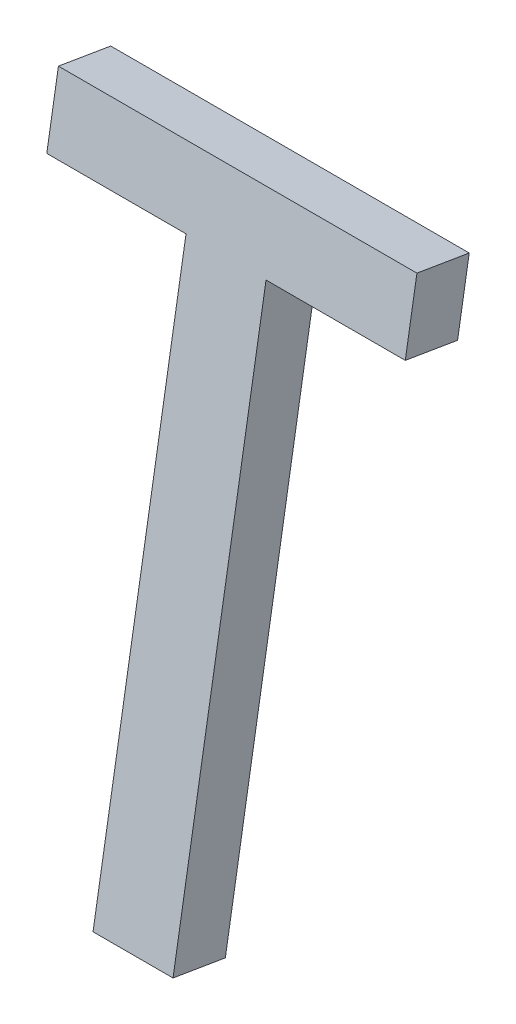
ISO-10303-21;
HEADER;
FILE_DESCRIPTION(('STEP AP214'),'2;1');
FILE_NAME('part.step','',(''),(''),'','','');
FILE_SCHEMA(('AUTOMOTIVE_DESIGN { 1 0 10303 214 1 1 1 1 }'));
ENDSEC;
DATA;
#1=APPLICATION_CONTEXT('core data for automotive mechanical design processes');
#2=APPLICATION_PROTOCOL_DEFINITION('international standard','automotive_design',2000,#1);
#3=PRODUCT_CONTEXT('',#1,'mechanical');
#4=PRODUCT('Part','Part','',(#3));
#5=PRODUCT_RELATED_PRODUCT_CATEGORY('part','',(#4));
#6=PRODUCT_DEFINITION_FORMATION('','',#4);
#7=PRODUCT_DEFINITION_CONTEXT('part definition',#1,'design');
#8=PRODUCT_DEFINITION('design','',#6,#7);
#9=PRODUCT_DEFINITION_SHAPE('','',#8);
#10=(LENGTH_UNIT() NAMED_UNIT(*) SI_UNIT(.MILLI.,.METRE.));
#11=(NAMED_UNIT(*) PLANE_ANGLE_UNIT() SI_UNIT($,.RADIAN.));
#12=(NAMED_UNIT(*) SI_UNIT($,.STERADIAN.) SOLID_ANGLE_UNIT());
#13=UNCERTAINTY_MEASURE_WITH_UNIT(LENGTH_MEASURE(1.E-05),#10,'distance_accuracy_value','');
#14=(GEOMETRIC_REPRESENTATION_CONTEXT(3) GLOBAL_UNCERTAINTY_ASSIGNED_CONTEXT((#13)) GLOBAL_UNIT_ASSIGNED_CONTEXT((#10,
#11,#12)) REPRESENTATION_CONTEXT('',''));
#15=CARTESIAN_POINT('',(0.,0.,0.));
#16=DIRECTION('',(0.,0.,1.));
#17=DIRECTION('',(1.,0.,0.));
#18=AXIS2_PLACEMENT_3D('',#15,#16,#17);
#19=CARTESIAN_POINT('',(1281.84563758389,1142.41768553082,1243.97176701001));
#20=DIRECTION('',(0.,0.986393923832144,-0.164398987305355));
#21=DIRECTION('',(0.,0.164398987305355,0.986393923832144));
#22=AXIS2_PLACEMENT_3D('',#19,#20,#21);
#23=PLANE('',#22);
#24=CARTESIAN_POINT('',(1281.84563758389,1141.5956905943,1239.03979739085));
#25=CARTESIAN_POINT('',(1286.22184936614,1141.5956905943,1239.03979739085));
#26=CARTESIAN_POINT('',(1290.59806114839,1141.5956905943,1239.03979739085));
#27=CARTESIAN_POINT('',(1294.97427293065,1141.5956905943,1239.03979739085));
#28=B_SPLINE_CURVE_WITH_KNOTS('',3,(#24,#25,#26,#27),.UNSPECIFIED.,.F.,.F.,(4,4),(0.,
0.0699822316562725),.UNSPECIFIED.);
#29=CARTESIAN_POINT('',(1281.84563758389,1141.5956905943,1239.03979739085));
#30=VERTEX_POINT('',#29);
#31=CARTESIAN_POINT('',(1294.97427293065,1141.5956905943,1239.03979739085));
#32=VERTEX_POINT('',#31);
#33=EDGE_CURVE('E90',#30,#32,#28,.T.);
#34=ORIENTED_EDGE('',*,*,#33,.T.);
#35=DIRECTION('',(0.,-0.164398987305355,-0.986393923832144));
#36=VECTOR('',#35,1.);
#37=CARTESIAN_POINT('',(1294.97427293065,1142.41768553082,1243.97176701001));
#38=LINE('',#37,#36);
#39=CARTESIAN_POINT('',(1294.97427293065,1142.41768553082,1243.97176701001));
#40=VERTEX_POINT('',#39);
#41=EDGE_CURVE('E99',#40,#32,#38,.T.);
#42=ORIENTED_EDGE('',*,*,#41,.F.);
#43=CARTESIAN_POINT('',(1281.84563758389,1142.41768553082,1243.97176701001));
#44=CARTESIAN_POINT('',(1286.22184936614,1142.41768553082,1243.97176701001));
#45=CARTESIAN_POINT('',(1290.59806114839,1142.41768553082,1243.97176701001));
#46=CARTESIAN_POINT('',(1294.97427293065,1142.41768553082,1243.97176701001));
#47=B_SPLINE_CURVE_WITH_KNOTS('',3,(#43,#44,#45,#46),.UNSPECIFIED.,.F.,.F.,(4,4),(0.,
0.0699822316562725),.UNSPECIFIED.);
#48=CARTESIAN_POINT('',(1281.84563758389,1142.41768553082,1243.97176701001));
#49=VERTEX_POINT('',#48);
#50=EDGE_CURVE('E104',#49,#40,#47,.T.);
#51=ORIENTED_EDGE('',*,*,#50,.F.);
#52=DIRECTION('',(0.,-0.164398987305355,-0.986393923832144));
#53=VECTOR('',#52,1.);
#54=CARTESIAN_POINT('',(1281.84563758389,1142.41768553082,1243.97176701001));
#55=LINE('',#54,#53);
#56=EDGE_CURVE('E96',#49,#30,#55,.T.);
#57=ORIENTED_EDGE('',*,*,#56,.T.);
#58=EDGE_LOOP('',(#34,#42,#51,#57));
#59=FACE_BOUND('',#58,.T.);
#60=ADVANCED_FACE('F17',(#59),#23,.F.);
#61=CARTESIAN_POINT('',(1294.97427293065,1142.41768553082,1243.97176701001));
#62=DIRECTION('',(-1.,0.,0.));
#63=DIRECTION('',(0.,0.,1.));
#64=AXIS2_PLACEMENT_3D('',#61,#62,#63);
#65=PLANE('',#64);
#66=CARTESIAN_POINT('',(1294.97427293065,1141.5956905943,1239.03979739085));
#67=CARTESIAN_POINT('',(1294.97427293065,1143.7886382785,1238.67430611015));
#68=CARTESIAN_POINT('',(1294.97427293065,1145.9815859627,1238.30881482945));
#69=CARTESIAN_POINT('',(1294.97427293065,1148.17453364691,1237.94332354875));
#70=B_SPLINE_CURVE_WITH_KNOTS('',3,(#66,#67,#68,#69),.UNSPECIFIED.,.F.,.F.,(4,4),
(0.0699822316562725,0.105534501961435),.UNSPECIFIED.);
#71=CARTESIAN_POINT('',(1294.97427293065,1148.17453364691,1237.94332354875));
#72=VERTEX_POINT('',#71);
#73=EDGE_CURVE('E87',#32,#72,#70,.T.);
#74=ORIENTED_EDGE('',*,*,#73,.T.);
#75=DIRECTION('',(0.,-0.164398987305355,-0.986393923832144));
#76=VECTOR('',#75,1.);
#77=CARTESIAN_POINT('',(1294.97427293065,1148.99652858344,1242.87529316791));
#78=LINE('',#77,#76);
#79=CARTESIAN_POINT('',(1294.97427293065,1148.99652858344,1242.87529316791));
#80=VERTEX_POINT('',#79);
#81=EDGE_CURVE('E95',#80,#72,#78,.T.);
#82=ORIENTED_EDGE('',*,*,#81,.F.);
#83=CARTESIAN_POINT('',(1294.97427293065,1142.41768553082,1243.97176701001));
#84=CARTESIAN_POINT('',(1294.97427293065,1144.61063321503,1243.60627572931));
#85=CARTESIAN_POINT('',(1294.97427293065,1146.80358089923,1243.24078444861));
#86=CARTESIAN_POINT('',(1294.97427293065,1148.99652858344,1242.87529316791));
#87=B_SPLINE_CURVE_WITH_KNOTS('',3,(#83,#84,#85,#86),.UNSPECIFIED.,.F.,.F.,(4,4),
(0.0699822316562725,0.105534501961435),.UNSPECIFIED.);
#88=EDGE_CURVE('E81',#40,#80,#87,.T.);
#89=ORIENTED_EDGE('',*,*,#88,.F.);
#90=ORIENTED_EDGE('',*,*,#41,.T.);
#91=EDGE_LOOP('',(#74,#82,#89,#90));
#92=FACE_BOUND('',#91,.T.);
#93=ADVANCED_FACE('F100',(#92),#65,.F.);
#94=CARTESIAN_POINT('',(1294.97427293065,1148.99652858344,1242.87529316791));
#95=DIRECTION('',(0.,-0.986393923832144,0.164398987305355));
#96=DIRECTION('',(0.,-0.164398987305355,-0.986393923832144));
#97=AXIS2_PLACEMENT_3D('',#94,#95,#96);
#98=PLANE('',#97);
#99=CARTESIAN_POINT('',(1294.97427293065,1148.17453364691,1237.94332354875));
#100=CARTESIAN_POINT('',(1283.70768083519,1148.17453364691,1237.94332354875));
#101=CARTESIAN_POINT('',(1272.44108873974,1148.17453364691,1237.94332354875));
#102=CARTESIAN_POINT('',(1261.17449664429,1148.17453364691,1237.94332354875));
#103=B_SPLINE_CURVE_WITH_KNOTS('',3,(#99,#100,#101,#102),.UNSPECIFIED.,.F.,.F.,(4,4),
(0.105534501961435,0.285704314857198),.UNSPECIFIED.);
#104=CARTESIAN_POINT('',(1261.17449664429,1148.17453364691,1237.94332354875));
#105=VERTEX_POINT('',#104);
#106=EDGE_CURVE('E92',#72,#105,#103,.T.);
#107=ORIENTED_EDGE('',*,*,#106,.T.);
#108=DIRECTION('',(0.,-0.164398987305355,-0.986393923832144));
#109=VECTOR('',#108,1.);
#110=CARTESIAN_POINT('',(1261.17449664429,1148.99652858344,1242.87529316791));
#111=LINE('',#110,#109);
#112=CARTESIAN_POINT('',(1261.17449664429,1148.99652858344,1242.87529316791));
#113=VERTEX_POINT('',#112);
#114=EDGE_CURVE('E151',#113,#105,#111,.T.);
#115=ORIENTED_EDGE('',*,*,#114,.F.);
#116=CARTESIAN_POINT('',(1294.97427293065,1148.99652858344,1242.87529316791));
#117=CARTESIAN_POINT('',(1283.70768083519,1148.99652858344,1242.87529316791));
#118=CARTESIAN_POINT('',(1272.44108873974,1148.99652858344,1242.87529316791));
#119=CARTESIAN_POINT('',(1261.17449664429,1148.99652858344,1242.87529316791));
#120=B_SPLINE_CURVE_WITH_KNOTS('',3,(#116,#117,#118,#119),.UNSPECIFIED.,.F.,.F.,(4,4),
(0.105534501961435,0.285704314857198),.UNSPECIFIED.);
#121=EDGE_CURVE('E155',#80,#113,#120,.T.);
#122=ORIENTED_EDGE('',*,*,#121,.F.);
#123=ORIENTED_EDGE('',*,*,#81,.T.);
#124=EDGE_LOOP('',(#107,#115,#122,#123));
#125=FACE_BOUND('',#124,.T.);
#126=ADVANCED_FACE('F300',(#125),#98,.F.);
#127=CARTESIAN_POINT('',(1261.17449664429,1148.99652858344,1242.87529316791));
#128=DIRECTION('',(1.,0.,0.));
#129=DIRECTION('',(0.,0.,-1.));
#130=AXIS2_PLACEMENT_3D('',#127,#128,#129);
#131=PLANE('',#130);
#132=CARTESIAN_POINT('',(1261.17449664429,1148.17453364691,1237.94332354875));
#133=CARTESIAN_POINT('',(1261.17449664429,1145.9815859627,1238.30881482945));
#134=CARTESIAN_POINT('',(1261.17449664429,1143.7886382785,1238.67430611015));
#135=CARTESIAN_POINT('',(1261.17449664429,1141.5956905943,1239.03979739085));
#136=B_SPLINE_CURVE_WITH_KNOTS('',3,(#132,#133,#134,#135),.UNSPECIFIED.,.F.,.F.,(4,4),
(0.285704314857198,0.321256585162361),.UNSPECIFIED.);
#137=CARTESIAN_POINT('',(1261.17449664429,1141.5956905943,1239.03979739085));
#138=VERTEX_POINT('',#137);
#139=EDGE_CURVE('E165',#105,#138,#136,.T.);
#140=ORIENTED_EDGE('',*,*,#139,.T.);
#141=DIRECTION('',(0.,-0.164398987305355,-0.986393923832144));
#142=VECTOR('',#141,1.);
#143=CARTESIAN_POINT('',(1261.17449664429,1142.41768553082,1243.97176701001));
#144=LINE('',#143,#142);
#145=CARTESIAN_POINT('',(1261.17449664429,1142.41768553082,1243.97176701001));
#146=VERTEX_POINT('',#145);
#147=EDGE_CURVE('E175',#146,#138,#144,.T.);
#148=ORIENTED_EDGE('',*,*,#147,.F.);
#149=CARTESIAN_POINT('',(1261.17449664429,1148.99652858344,1242.87529316791));
#150=CARTESIAN_POINT('',(1261.17449664429,1146.80358089923,1243.24078444861));
#151=CARTESIAN_POINT('',(1261.17449664429,1144.61063321503,1243.60627572931));
#152=CARTESIAN_POINT('',(1261.17449664429,1142.41768553082,1243.97176701001));
#153=B_SPLINE_CURVE_WITH_KNOTS('',3,(#149,#150,#151,#152),.UNSPECIFIED.,.F.,.F.,(4,4),
(0.285704314857198,0.321256585162361),.UNSPECIFIED.);
#154=EDGE_CURVE('E179',#113,#146,#153,.T.);
#155=ORIENTED_EDGE('',*,*,#154,.F.);
#156=ORIENTED_EDGE('',*,*,#114,.T.);
#157=EDGE_LOOP('',(#140,#148,#155,#156));
#158=FACE_BOUND('',#157,.T.);
#159=ADVANCED_FACE('F295',(#158),#131,.F.);
#160=CARTESIAN_POINT('',(1261.17449664429,1142.41768553082,1243.97176701001));
#161=DIRECTION('',(0.,0.986393923832144,-0.164398987305355));
#162=DIRECTION('',(0.,0.164398987305355,0.986393923832144));
#163=AXIS2_PLACEMENT_3D('',#160,#161,#162);
#164=PLANE('',#163);
#165=CARTESIAN_POINT('',(1261.17449664429,1141.5956905943,1239.03979739085));
#166=CARTESIAN_POINT('',(1265.55070842654,1141.5956905943,1239.03979739085));
#167=CARTESIAN_POINT('',(1269.9269202088,1141.5956905943,1239.03979739085));
#168=CARTESIAN_POINT('',(1274.30313199105,1141.5956905943,1239.03979739085));
#169=B_SPLINE_CURVE_WITH_KNOTS('',3,(#165,#166,#167,#168),.UNSPECIFIED.,.F.,.F.,(4,4),
(0.321256585162361,0.391238816818633),.UNSPECIFIED.);
#170=CARTESIAN_POINT('',(1274.30313199105,1141.5956905943,1239.03979739085));
#171=VERTEX_POINT('',#170);
#172=EDGE_CURVE('E189',#138,#171,#169,.T.);
#173=ORIENTED_EDGE('',*,*,#172,.T.);
#174=DIRECTION('',(0.,-0.164398987305355,-0.986393923832144));
#175=VECTOR('',#174,1.);
#176=CARTESIAN_POINT('',(1274.30313199105,1142.41768553082,1243.97176701001));
#177=LINE('',#176,#175);
#178=CARTESIAN_POINT('',(1274.30313199105,1142.41768553082,1243.97176701001));
#179=VERTEX_POINT('',#178);
#180=EDGE_CURVE('E199',#179,#171,#177,.T.);
#181=ORIENTED_EDGE('',*,*,#180,.F.);
#182=CARTESIAN_POINT('',(1261.17449664429,1142.41768553082,1243.97176701001));
#183=CARTESIAN_POINT('',(1265.55070842654,1142.41768553082,1243.97176701001));
#184=CARTESIAN_POINT('',(1269.9269202088,1142.41768553082,1243.97176701001));
#185=CARTESIAN_POINT('',(1274.30313199105,1142.41768553082,1243.97176701001));
#186=B_SPLINE_CURVE_WITH_KNOTS('',3,(#182,#183,#184,#185),.UNSPECIFIED.,.F.,.F.,(4,4),
(0.321256585162361,0.391238816818633),.UNSPECIFIED.);
#187=EDGE_CURVE('E203',#146,#179,#186,.T.);
#188=ORIENTED_EDGE('',*,*,#187,.F.);
#189=ORIENTED_EDGE('',*,*,#147,.T.);
#190=EDGE_LOOP('',(#173,#181,#188,#189));
#191=FACE_BOUND('',#190,.T.);
#192=ADVANCED_FACE('F292',(#191),#164,.F.);
#193=CARTESIAN_POINT('',(1274.30313199105,1142.41768553082,1243.97176701001));
#194=DIRECTION('',(1.,0.,0.));
#195=DIRECTION('',(0.,1.,0.));
#196=AXIS2_PLACEMENT_3D('',#193,#194,#195);
#197=PLANE('',#196);
#198=CARTESIAN_POINT('',(1274.30313199105,1141.5956905943,1239.03979739085));
#199=CARTESIAN_POINT('',(1274.30313199105,1124.06075980186,1241.96228585625));
#200=CARTESIAN_POINT('',(1274.30313199105,1106.52582900942,1244.88477432166));
#201=CARTESIAN_POINT('',(1274.30313199105,1088.99089821698,1247.80726278707));
#202=B_SPLINE_CURVE_WITH_KNOTS('',3,(#198,#199,#200,#201),.UNSPECIFIED.,.F.,.F.,(4,4),
(0.391238816818633,0.675516733617708),.UNSPECIFIED.);
#203=CARTESIAN_POINT('',(1274.30313199105,1088.99089821698,1247.80726278707));
#204=VERTEX_POINT('',#203);
#205=EDGE_CURVE('E213',#171,#204,#202,.T.);
#206=ORIENTED_EDGE('',*,*,#205,.T.);
#207=DIRECTION('',(0.,-0.164398987305355,-0.986393923832144));
#208=VECTOR('',#207,1.);
#209=CARTESIAN_POINT('',(1274.30313199105,1089.81289315351,1252.73923240623));
#210=LINE('',#209,#208);
#211=CARTESIAN_POINT('',(1274.30313199105,1089.81289315351,1252.73923240623));
#212=VERTEX_POINT('',#211);
#213=EDGE_CURVE('E223',#212,#204,#210,.T.);
#214=ORIENTED_EDGE('',*,*,#213,.F.);
#215=CARTESIAN_POINT('',(1274.30313199105,1142.41768553082,1243.97176701001));
#216=CARTESIAN_POINT('',(1274.30313199105,1124.88275473838,1246.89425547542));
#217=CARTESIAN_POINT('',(1274.30313199105,1107.34782394595,1249.81674394082));
#218=CARTESIAN_POINT('',(1274.30313199105,1089.81289315351,1252.73923240623));
#219=B_SPLINE_CURVE_WITH_KNOTS('',3,(#215,#216,#217,#218),.UNSPECIFIED.,.F.,.F.,(4,4),
(0.391238816818633,0.675516733617708),.UNSPECIFIED.);
#220=EDGE_CURVE('E227',#179,#212,#219,.T.);
#221=ORIENTED_EDGE('',*,*,#220,.F.);
#222=ORIENTED_EDGE('',*,*,#180,.T.);
#223=EDGE_LOOP('',(#206,#214,#221,#222));
#224=FACE_BOUND('',#223,.T.);
#225=ADVANCED_FACE('F288',(#224),#197,.F.);
#226=CARTESIAN_POINT('',(1274.30313199105,1089.81289315351,1252.73923240623));
#227=DIRECTION('',(0.,0.986393923832144,-0.164398987305355));
#228=DIRECTION('',(0.,0.164398987305355,0.986393923832144));
#229=AXIS2_PLACEMENT_3D('',#226,#227,#228);
#230=PLANE('',#229);
#231=CARTESIAN_POINT('',(1274.30313199105,1088.99089821698,1247.80726278707));
#232=CARTESIAN_POINT('',(1276.817300522,1088.99089821698,1247.80726278707));
#233=CARTESIAN_POINT('',(1279.33146905294,1088.99089821698,1247.80726278707));
#234=CARTESIAN_POINT('',(1281.84563758389,1088.99089821698,1247.80726278707));
#235=B_SPLINE_CURVE_WITH_KNOTS('',3,(#231,#232,#233,#234),.UNSPECIFIED.,.F.,.F.,(4,4),
(0.675516733617708,0.715722083200926),.UNSPECIFIED.);
#236=CARTESIAN_POINT('',(1281.84563758389,1088.99089821698,1247.80726278707));
#237=VERTEX_POINT('',#236);
#238=EDGE_CURVE('E237',#204,#237,#235,.T.);
#239=ORIENTED_EDGE('',*,*,#238,.T.);
#240=DIRECTION('',(0.,-0.164398987305355,-0.986393923832144));
#241=VECTOR('',#240,1.);
#242=CARTESIAN_POINT('',(1281.84563758389,1089.81289315351,1252.73923240623));
#243=LINE('',#242,#241);
#244=CARTESIAN_POINT('',(1281.84563758389,1089.81289315351,1252.73923240623));
#245=VERTEX_POINT('',#244);
#246=EDGE_CURVE('E247',#245,#237,#243,.T.);
#247=ORIENTED_EDGE('',*,*,#246,.F.);
#248=CARTESIAN_POINT('',(1274.30313199105,1089.81289315351,1252.73923240623));
#249=CARTESIAN_POINT('',(1276.817300522,1089.81289315351,1252.73923240623));
#250=CARTESIAN_POINT('',(1279.33146905294,1089.81289315351,1252.73923240623));
#251=CARTESIAN_POINT('',(1281.84563758389,1089.81289315351,1252.73923240623));
#252=B_SPLINE_CURVE_WITH_KNOTS('',3,(#248,#249,#250,#251),.UNSPECIFIED.,.F.,.F.,(4,4),
(0.675516733617708,0.715722083200926),.UNSPECIFIED.);
#253=EDGE_CURVE('E38',#212,#245,#252,.T.);
#254=ORIENTED_EDGE('',*,*,#253,.F.);
#255=ORIENTED_EDGE('',*,*,#213,.T.);
#256=EDGE_LOOP('',(#239,#247,#254,#255));
#257=FACE_BOUND('',#256,.T.);
#258=ADVANCED_FACE('F284',(#257),#230,.F.);
#259=CARTESIAN_POINT('',(1281.84563758389,1089.81289315351,1252.73923240623));
#260=DIRECTION('',(-1.,0.,0.));
#261=DIRECTION('',(0.,-1.,0.));
#262=AXIS2_PLACEMENT_3D('',#259,#260,#261);
#263=PLANE('',#262);
#264=CARTESIAN_POINT('',(1281.84563758389,1088.99089821698,1247.80726278707));
#265=CARTESIAN_POINT('',(1281.84563758389,1106.52582900942,1244.88477432166));
#266=CARTESIAN_POINT('',(1281.84563758389,1124.06075980186,1241.96228585625));
#267=CARTESIAN_POINT('',(1281.84563758389,1141.5956905943,1239.03979739085));
#268=B_SPLINE_CURVE_WITH_KNOTS('',3,(#264,#265,#266,#267),.UNSPECIFIED.,.F.,.F.,(4,4),
(0.715722083200926,1.),.UNSPECIFIED.);
#269=EDGE_CURVE('E30',#237,#30,#268,.T.);
#270=ORIENTED_EDGE('',*,*,#269,.T.);
#271=ORIENTED_EDGE('',*,*,#56,.F.);
#272=CARTESIAN_POINT('',(1281.84563758389,1089.81289315351,1252.73923240623));
#273=CARTESIAN_POINT('',(1281.84563758389,1107.34782394595,1249.81674394082));
#274=CARTESIAN_POINT('',(1281.84563758389,1124.88275473838,1246.89425547542));
#275=CARTESIAN_POINT('',(1281.84563758389,1142.41768553082,1243.97176701001));
#276=B_SPLINE_CURVE_WITH_KNOTS('',3,(#272,#273,#274,#275),.UNSPECIFIED.,.F.,.F.,(4,4),
(0.715722083200926,1.),.UNSPECIFIED.);
#277=EDGE_CURVE('E11',#245,#49,#276,.T.);
#278=ORIENTED_EDGE('',*,*,#277,.F.);
#279=ORIENTED_EDGE('',*,*,#246,.T.);
#280=EDGE_LOOP('',(#270,#271,#278,#279));
#281=FACE_BOUND('',#280,.T.);
#282=ADVANCED_FACE('F278',(#281),#263,.F.);
#283=CARTESIAN_POINT('',(1288.40995525727,1142.41768553082,1243.97176701001));
#284=DIRECTION('',(0.,-0.164398987305244,-0.986393923832163));
#285=DIRECTION('',(0.,0.986393923832163,-0.164398987305244));
#286=AXIS2_PLACEMENT_3D('',#283,#284,#285);
#287=PLANE('',#286);
#288=ORIENTED_EDGE('',*,*,#50,.T.);
#289=ORIENTED_EDGE('',*,*,#88,.T.);
#290=ORIENTED_EDGE('',*,*,#121,.T.);
#291=ORIENTED_EDGE('',*,*,#154,.T.);
#292=ORIENTED_EDGE('',*,*,#187,.T.);
#293=ORIENTED_EDGE('',*,*,#220,.T.);
#294=ORIENTED_EDGE('',*,*,#253,.T.);
#295=ORIENTED_EDGE('',*,*,#277,.T.);
#296=EDGE_LOOP('',(#288,#289,#290,#291,#292,#293,#294,#295));
#297=FACE_BOUND('',#296,.T.);
#298=ADVANCED_FACE('F301',(#297),#287,.F.);
#299=CARTESIAN_POINT('',(1288.40995525727,1141.5956905943,1239.03979739085));
#300=DIRECTION('',(0.,-0.164398987305244,-0.986393923832163));
#301=DIRECTION('',(0.,0.986393923832163,-0.164398987305244));
#302=AXIS2_PLACEMENT_3D('',#299,#300,#301);
#303=PLANE('',#302);
#304=ORIENTED_EDGE('',*,*,#33,.F.);
#305=ORIENTED_EDGE('',*,*,#269,.F.);
#306=ORIENTED_EDGE('',*,*,#238,.F.);
#307=ORIENTED_EDGE('',*,*,#205,.F.);
#308=ORIENTED_EDGE('',*,*,#172,.F.);
#309=ORIENTED_EDGE('',*,*,#139,.F.);
#310=ORIENTED_EDGE('',*,*,#106,.F.);
#311=ORIENTED_EDGE('',*,*,#73,.F.);
#312=EDGE_LOOP('',(#304,#305,#306,#307,#308,#309,#310,#311));
#313=FACE_BOUND('',#312,.T.);
#314=ADVANCED_FACE('F19',(#313),#303,.T.);
#315=CLOSED_SHELL('',(#60,#93,#126,#159,#192,#225,#258,#282,#298,#314));
#316=MANIFOLD_SOLID_BREP('B1',#315);
#317=ADVANCED_BREP_SHAPE_REPRESENTATION('',(#18,#316),#14);
#318=SHAPE_DEFINITION_REPRESENTATION(#9,#317);
ENDSEC;
END-ISO-10303-21;
